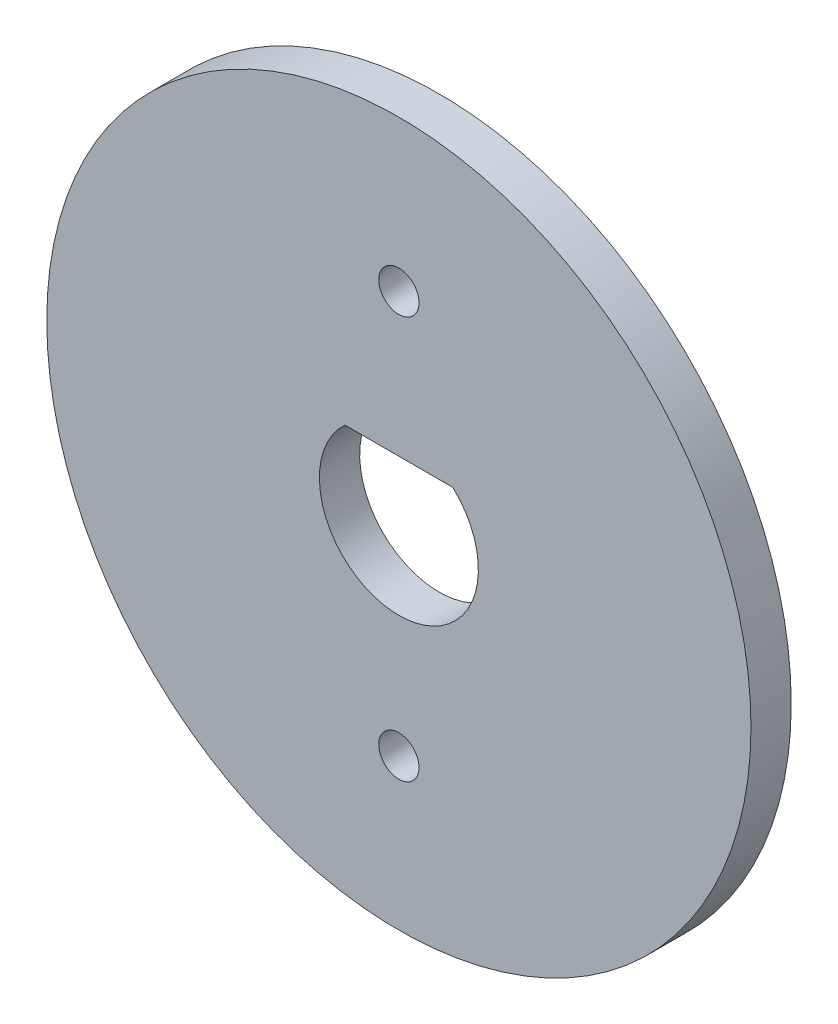
ISO-10303-21;
HEADER;
FILE_DESCRIPTION(('STEP AP214'),'2;1');
FILE_NAME('part.step','',(''),(''),'','','');
FILE_SCHEMA(('AUTOMOTIVE_DESIGN { 1 0 10303 214 1 1 1 1 }'));
ENDSEC;
DATA;
#1=APPLICATION_CONTEXT('core data for automotive mechanical design processes');
#2=APPLICATION_PROTOCOL_DEFINITION('international standard','automotive_design',2000,#1);
#3=PRODUCT_CONTEXT('',#1,'mechanical');
#4=PRODUCT('Part','Part','',(#3));
#5=PRODUCT_RELATED_PRODUCT_CATEGORY('part','',(#4));
#6=PRODUCT_DEFINITION_FORMATION('','',#4);
#7=PRODUCT_DEFINITION_CONTEXT('part definition',#1,'design');
#8=PRODUCT_DEFINITION('design','',#6,#7);
#9=PRODUCT_DEFINITION_SHAPE('','',#8);
#10=(LENGTH_UNIT() NAMED_UNIT(*) SI_UNIT(.MILLI.,.METRE.));
#11=(NAMED_UNIT(*) PLANE_ANGLE_UNIT() SI_UNIT($,.RADIAN.));
#12=(NAMED_UNIT(*) SI_UNIT($,.STERADIAN.) SOLID_ANGLE_UNIT());
#13=UNCERTAINTY_MEASURE_WITH_UNIT(LENGTH_MEASURE(1.E-05),#10,'distance_accuracy_value','');
#14=(GEOMETRIC_REPRESENTATION_CONTEXT(3) GLOBAL_UNCERTAINTY_ASSIGNED_CONTEXT((#13)) GLOBAL_UNIT_ASSIGNED_CONTEXT((#10,
#11,#12)) REPRESENTATION_CONTEXT('',''));
#15=CARTESIAN_POINT('',(0.,0.,0.));
#16=DIRECTION('',(0.,0.,1.));
#17=DIRECTION('',(1.,0.,0.));
#18=AXIS2_PLACEMENT_3D('',#15,#16,#17);
#19=CARTESIAN_POINT('',(0.,0.,2.));
#20=DIRECTION('',(0.,0.,1.));
#21=DIRECTION('',(1.,0.,0.));
#22=AXIS2_PLACEMENT_3D('',#19,#20,#21);
#23=PLANE('',#22);
#24=CARTESIAN_POINT('',(0.,-10.,2.));
#25=DIRECTION('',(0.,0.,1.));
#26=DIRECTION('',(1.,0.,0.));
#27=AXIS2_PLACEMENT_3D('',#24,#25,#26);
#28=CIRCLE('',#27,1.);
#29=CARTESIAN_POINT('',(1.,-10.,2.));
#30=VERTEX_POINT('',#29);
#31=EDGE_CURVE('E79',#30,#30,#28,.T.);
#32=ORIENTED_EDGE('',*,*,#31,.F.);
#33=EDGE_LOOP('',(#32));
#34=FACE_BOUND('',#33,.T.);
#35=CARTESIAN_POINT('',(0.,0.,2.));
#36=DIRECTION('',(0.,0.,1.));
#37=DIRECTION('',(1.,0.,0.));
#38=AXIS2_PLACEMENT_3D('',#35,#36,#37);
#39=CIRCLE('',#38,17.5);
#40=CARTESIAN_POINT('',(17.5,0.,2.));
#41=VERTEX_POINT('',#40);
#42=EDGE_CURVE('E11',#41,#41,#39,.T.);
#43=ORIENTED_EDGE('',*,*,#42,.T.);
#44=EDGE_LOOP('',(#43));
#45=FACE_BOUND('',#44,.T.);
#46=CARTESIAN_POINT('',(0.,10.,2.));
#47=DIRECTION('',(0.,0.,1.));
#48=DIRECTION('',(1.,0.,0.));
#49=AXIS2_PLACEMENT_3D('',#46,#47,#48);
#50=CIRCLE('',#49,1.);
#51=CARTESIAN_POINT('',(1.,10.,2.));
#52=VERTEX_POINT('',#51);
#53=EDGE_CURVE('E85',#52,#52,#50,.T.);
#54=ORIENTED_EDGE('',*,*,#53,.F.);
#55=EDGE_LOOP('',(#54));
#56=FACE_BOUND('',#55,.T.);
#57=DIRECTION('',(-1.,0.,0.));
#58=VECTOR('',#57,1.);
#59=CARTESIAN_POINT('',(2.68188366638078,2.9,2.));
#60=LINE('',#59,#58);
#61=CARTESIAN_POINT('',(2.68188366638078,2.9,2.));
#62=VERTEX_POINT('',#61);
#63=CARTESIAN_POINT('',(-2.68188366638078,2.9,2.));
#64=VERTEX_POINT('',#63);
#65=EDGE_CURVE('E75',#62,#64,#60,.T.);
#66=ORIENTED_EDGE('',*,*,#65,.F.);
#67=CARTESIAN_POINT('',(0.,0.,2.));
#68=DIRECTION('',(0.,0.,1.));
#69=DIRECTION('',(1.,0.,0.));
#70=AXIS2_PLACEMENT_3D('',#67,#68,#69);
#71=CIRCLE('',#70,3.95);
#72=EDGE_CURVE('E65',#64,#62,#71,.T.);
#73=ORIENTED_EDGE('',*,*,#72,.F.);
#74=EDGE_LOOP('',(#66,#73));
#75=FACE_BOUND('',#74,.T.);
#76=ADVANCED_FACE('F33',(#34,#45,#56,#75),#23,.T.);
#77=CARTESIAN_POINT('',(0.,0.,0.));
#78=DIRECTION('',(0.,0.,1.));
#79=DIRECTION('',(1.,0.,0.));
#80=AXIS2_PLACEMENT_3D('',#77,#78,#79);
#81=PLANE('',#80);
#82=CARTESIAN_POINT('',(0.,-10.,0.));
#83=DIRECTION('',(0.,0.,1.));
#84=DIRECTION('',(1.,0.,0.));
#85=AXIS2_PLACEMENT_3D('',#82,#83,#84);
#86=CIRCLE('',#85,1.);
#87=CARTESIAN_POINT('',(1.,-10.,0.));
#88=VERTEX_POINT('',#87);
#89=EDGE_CURVE('E70',#88,#88,#86,.T.);
#90=ORIENTED_EDGE('',*,*,#89,.T.);
#91=EDGE_LOOP('',(#90));
#92=FACE_BOUND('',#91,.T.);
#93=CARTESIAN_POINT('',(0.,0.,0.));
#94=DIRECTION('',(0.,0.,1.));
#95=DIRECTION('',(1.,0.,0.));
#96=AXIS2_PLACEMENT_3D('',#93,#94,#95);
#97=CIRCLE('',#96,17.5);
#98=CARTESIAN_POINT('',(17.5,0.,0.));
#99=VERTEX_POINT('',#98);
#100=EDGE_CURVE('E37',#99,#99,#97,.T.);
#101=ORIENTED_EDGE('',*,*,#100,.F.);
#102=EDGE_LOOP('',(#101));
#103=FACE_BOUND('',#102,.T.);
#104=CARTESIAN_POINT('',(0.,10.,0.));
#105=DIRECTION('',(0.,0.,1.));
#106=DIRECTION('',(1.,0.,0.));
#107=AXIS2_PLACEMENT_3D('',#104,#105,#106);
#108=CIRCLE('',#107,1.);
#109=CARTESIAN_POINT('',(1.,10.,0.));
#110=VERTEX_POINT('',#109);
#111=EDGE_CURVE('E82',#110,#110,#108,.T.);
#112=ORIENTED_EDGE('',*,*,#111,.T.);
#113=EDGE_LOOP('',(#112));
#114=FACE_BOUND('',#113,.T.);
#115=CARTESIAN_POINT('',(0.,0.,0.));
#116=DIRECTION('',(0.,0.,1.));
#117=DIRECTION('',(1.,0.,0.));
#118=AXIS2_PLACEMENT_3D('',#115,#116,#117);
#119=CIRCLE('',#118,3.95);
#120=CARTESIAN_POINT('',(-2.68188366638078,2.9,0.));
#121=VERTEX_POINT('',#120);
#122=CARTESIAN_POINT('',(2.68188366638078,2.9,0.));
#123=VERTEX_POINT('',#122);
#124=EDGE_CURVE('E55',#121,#123,#119,.T.);
#125=ORIENTED_EDGE('',*,*,#124,.T.);
#126=DIRECTION('',(-1.,0.,0.));
#127=VECTOR('',#126,1.);
#128=CARTESIAN_POINT('',(2.68188366638078,2.9,0.));
#129=LINE('',#128,#127);
#130=EDGE_CURVE('E61',#123,#121,#129,.T.);
#131=ORIENTED_EDGE('',*,*,#130,.T.);
#132=EDGE_LOOP('',(#125,#131));
#133=FACE_BOUND('',#132,.T.);
#134=ADVANCED_FACE('F72',(#92,#103,#114,#133),#81,.F.);
#135=CARTESIAN_POINT('',(0.,0.,2.));
#136=DIRECTION('',(0.,0.,-1.));
#137=DIRECTION('',(-1.,0.,0.));
#138=AXIS2_PLACEMENT_3D('',#135,#136,#137);
#139=CYLINDRICAL_SURFACE('',#138,17.5);
#140=ORIENTED_EDGE('',*,*,#42,.F.);
#141=EDGE_LOOP('',(#140));
#142=FACE_BOUND('',#141,.T.);
#143=ORIENTED_EDGE('',*,*,#100,.T.);
#144=EDGE_LOOP('',(#143));
#145=FACE_BOUND('',#144,.T.);
#146=ADVANCED_FACE('F35',(#142,#145),#139,.T.);
#147=CARTESIAN_POINT('',(0.,10.,2.));
#148=DIRECTION('',(0.,0.,-1.));
#149=DIRECTION('',(-1.,0.,0.));
#150=AXIS2_PLACEMENT_3D('',#147,#148,#149);
#151=CYLINDRICAL_SURFACE('',#150,1.);
#152=ORIENTED_EDGE('',*,*,#53,.T.);
#153=EDGE_LOOP('',(#152));
#154=FACE_BOUND('',#153,.T.);
#155=ORIENTED_EDGE('',*,*,#111,.F.);
#156=EDGE_LOOP('',(#155));
#157=FACE_BOUND('',#156,.T.);
#158=ADVANCED_FACE('F92',(#154,#157),#151,.F.);
#159=CARTESIAN_POINT('',(0.,-10.,2.));
#160=DIRECTION('',(0.,0.,-1.));
#161=DIRECTION('',(-1.,0.,0.));
#162=AXIS2_PLACEMENT_3D('',#159,#160,#161);
#163=CYLINDRICAL_SURFACE('',#162,1.);
#164=ORIENTED_EDGE('',*,*,#31,.T.);
#165=EDGE_LOOP('',(#164));
#166=FACE_BOUND('',#165,.T.);
#167=ORIENTED_EDGE('',*,*,#89,.F.);
#168=EDGE_LOOP('',(#167));
#169=FACE_BOUND('',#168,.T.);
#170=ADVANCED_FACE('F94',(#166,#169),#163,.F.);
#171=CARTESIAN_POINT('',(0.,0.,2.));
#172=DIRECTION('',(0.,0.,-1.));
#173=DIRECTION('',(-1.,0.,0.));
#174=AXIS2_PLACEMENT_3D('',#171,#172,#173);
#175=CYLINDRICAL_SURFACE('',#174,3.95);
#176=ORIENTED_EDGE('',*,*,#124,.F.);
#177=DIRECTION('',(0.,0.,-1.));
#178=VECTOR('',#177,1.);
#179=CARTESIAN_POINT('',(-2.68188366638078,2.9,2.));
#180=LINE('',#179,#178);
#181=EDGE_CURVE('E63',#64,#121,#180,.T.);
#182=ORIENTED_EDGE('',*,*,#181,.F.);
#183=ORIENTED_EDGE('',*,*,#72,.T.);
#184=DIRECTION('',(0.,0.,-1.));
#185=VECTOR('',#184,1.);
#186=CARTESIAN_POINT('',(2.68188366638078,2.9,2.));
#187=LINE('',#186,#185);
#188=EDGE_CURVE('E48',#62,#123,#187,.T.);
#189=ORIENTED_EDGE('',*,*,#188,.T.);
#190=EDGE_LOOP('',(#176,#182,#183,#189));
#191=FACE_BOUND('',#190,.T.);
#192=ADVANCED_FACE('F67',(#191),#175,.F.);
#193=CARTESIAN_POINT('',(2.68188366638078,2.9,2.));
#194=DIRECTION('',(0.,-1.,0.));
#195=DIRECTION('',(0.,0.,-1.));
#196=AXIS2_PLACEMENT_3D('',#193,#194,#195);
#197=PLANE('',#196);
#198=ORIENTED_EDGE('',*,*,#130,.F.);
#199=ORIENTED_EDGE('',*,*,#188,.F.);
#200=ORIENTED_EDGE('',*,*,#65,.T.);
#201=ORIENTED_EDGE('',*,*,#181,.T.);
#202=EDGE_LOOP('',(#198,#199,#200,#201));
#203=FACE_BOUND('',#202,.T.);
#204=ADVANCED_FACE('F62',(#203),#197,.T.);
#205=CLOSED_SHELL('',(#76,#134,#146,#158,#170,#192,#204));
#206=MANIFOLD_SOLID_BREP('B2',#205);
#207=ADVANCED_BREP_SHAPE_REPRESENTATION('',(#18,#206),#14);
#208=SHAPE_DEFINITION_REPRESENTATION(#9,#207);
ENDSEC;
END-ISO-10303-21;
